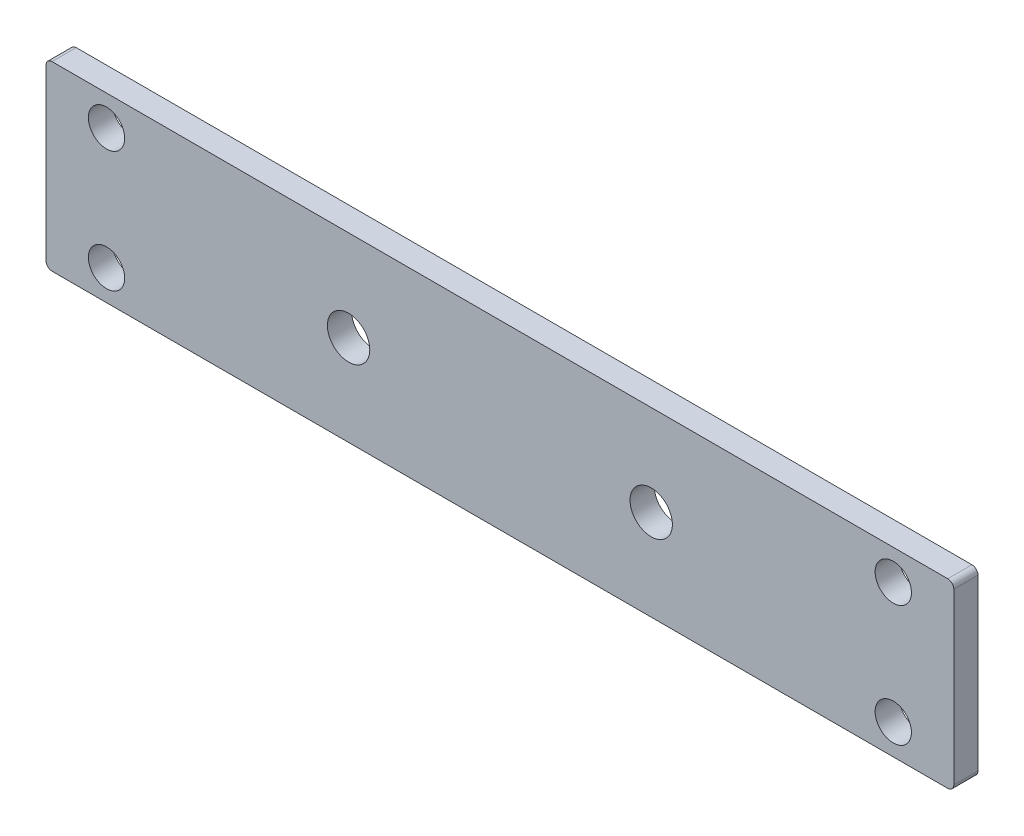
ISO-10303-21;
HEADER;
FILE_DESCRIPTION(('STEP AP214'),'2;1');
FILE_NAME('part.step','',(''),(''),'','','');
FILE_SCHEMA(('AUTOMOTIVE_DESIGN { 1 0 10303 214 1 1 1 1 }'));
ENDSEC;
DATA;
#1=APPLICATION_CONTEXT('core data for automotive mechanical design processes');
#2=APPLICATION_PROTOCOL_DEFINITION('international standard','automotive_design',2000,#1);
#3=PRODUCT_CONTEXT('',#1,'mechanical');
#4=PRODUCT('Part','Part','',(#3));
#5=PRODUCT_RELATED_PRODUCT_CATEGORY('part','',(#4));
#6=PRODUCT_DEFINITION_FORMATION('','',#4);
#7=PRODUCT_DEFINITION_CONTEXT('part definition',#1,'design');
#8=PRODUCT_DEFINITION('design','',#6,#7);
#9=PRODUCT_DEFINITION_SHAPE('','',#8);
#10=(LENGTH_UNIT() NAMED_UNIT(*) SI_UNIT(.MILLI.,.METRE.));
#11=(NAMED_UNIT(*) PLANE_ANGLE_UNIT() SI_UNIT($,.RADIAN.));
#12=(NAMED_UNIT(*) SI_UNIT($,.STERADIAN.) SOLID_ANGLE_UNIT());
#13=UNCERTAINTY_MEASURE_WITH_UNIT(LENGTH_MEASURE(1.E-05),#10,'distance_accuracy_value','');
#14=(GEOMETRIC_REPRESENTATION_CONTEXT(3) GLOBAL_UNCERTAINTY_ASSIGNED_CONTEXT((#13)) GLOBAL_UNIT_ASSIGNED_CONTEXT((#10,
#11,#12)) REPRESENTATION_CONTEXT('',''));
#15=CARTESIAN_POINT('',(0.,0.,0.));
#16=DIRECTION('',(0.,0.,1.));
#17=DIRECTION('',(1.,0.,0.));
#18=AXIS2_PLACEMENT_3D('',#15,#16,#17);
#19=CARTESIAN_POINT('',(-75.,-15.,-4.));
#20=DIRECTION('',(-1.,0.,0.));
#21=DIRECTION('',(0.,0.,1.));
#22=AXIS2_PLACEMENT_3D('',#19,#20,#21);
#23=PLANE('',#22);
#24=DIRECTION('',(0.,-1.,0.));
#25=VECTOR('',#24,1.);
#26=CARTESIAN_POINT('',(-75.,-15.,-4.));
#27=LINE('',#26,#25);
#28=CARTESIAN_POINT('',(-75.,14.,-4.));
#29=VERTEX_POINT('',#28);
#30=CARTESIAN_POINT('',(-75.,-14.,-4.));
#31=VERTEX_POINT('',#30);
#32=EDGE_CURVE('E168',#29,#31,#27,.T.);
#33=ORIENTED_EDGE('',*,*,#32,.T.);
#34=DIRECTION('',(0.,0.,1.));
#35=VECTOR('',#34,1.);
#36=CARTESIAN_POINT('',(-75.,-14.,-4.));
#37=LINE('',#36,#35);
#38=CARTESIAN_POINT('',(-75.,-14.,0.));
#39=VERTEX_POINT('',#38);
#40=EDGE_CURVE('E123',#31,#39,#37,.T.);
#41=ORIENTED_EDGE('',*,*,#40,.T.);
#42=DIRECTION('',(0.,-1.,0.));
#43=VECTOR('',#42,1.);
#44=CARTESIAN_POINT('',(-75.,-15.,0.));
#45=LINE('',#44,#43);
#46=CARTESIAN_POINT('',(-75.,14.,0.));
#47=VERTEX_POINT('',#46);
#48=EDGE_CURVE('E108',#47,#39,#45,.T.);
#49=ORIENTED_EDGE('',*,*,#48,.F.);
#50=DIRECTION('',(0.,0.,1.));
#51=VECTOR('',#50,1.);
#52=CARTESIAN_POINT('',(-75.,14.,-4.));
#53=LINE('',#52,#51);
#54=EDGE_CURVE('E120',#47,#29,#53,.F.);
#55=ORIENTED_EDGE('',*,*,#54,.T.);
#56=EDGE_LOOP('',(#33,#41,#49,#55));
#57=FACE_BOUND('',#56,.T.);
#58=ADVANCED_FACE('F38',(#57),#23,.T.);
#59=CARTESIAN_POINT('',(-75.,15.,-4.));
#60=DIRECTION('',(0.,1.,0.));
#61=DIRECTION('',(0.,0.,1.));
#62=AXIS2_PLACEMENT_3D('',#59,#60,#61);
#63=PLANE('',#62);
#64=DIRECTION('',(-1.,0.,0.));
#65=VECTOR('',#64,1.);
#66=CARTESIAN_POINT('',(-75.,15.,-4.));
#67=LINE('',#66,#65);
#68=CARTESIAN_POINT('',(74.,15.,-4.));
#69=VERTEX_POINT('',#68);
#70=CARTESIAN_POINT('',(-74.,15.,-4.));
#71=VERTEX_POINT('',#70);
#72=EDGE_CURVE('E130',#69,#71,#67,.T.);
#73=ORIENTED_EDGE('',*,*,#72,.T.);
#74=DIRECTION('',(0.,0.,1.));
#75=VECTOR('',#74,1.);
#76=CARTESIAN_POINT('',(-74.,15.,-4.));
#77=LINE('',#76,#75);
#78=CARTESIAN_POINT('',(-74.,15.,0.));
#79=VERTEX_POINT('',#78);
#80=EDGE_CURVE('E11',#71,#79,#77,.T.);
#81=ORIENTED_EDGE('',*,*,#80,.T.);
#82=DIRECTION('',(-1.,0.,0.));
#83=VECTOR('',#82,1.);
#84=CARTESIAN_POINT('',(-75.,15.,0.));
#85=LINE('',#84,#83);
#86=CARTESIAN_POINT('',(74.,15.,0.));
#87=VERTEX_POINT('',#86);
#88=EDGE_CURVE('E110',#87,#79,#85,.T.);
#89=ORIENTED_EDGE('',*,*,#88,.F.);
#90=DIRECTION('',(0.,0.,1.));
#91=VECTOR('',#90,1.);
#92=CARTESIAN_POINT('',(74.,15.,-4.));
#93=LINE('',#92,#91);
#94=EDGE_CURVE('E46',#87,#69,#93,.F.);
#95=ORIENTED_EDGE('',*,*,#94,.T.);
#96=EDGE_LOOP('',(#73,#81,#89,#95));
#97=FACE_BOUND('',#96,.T.);
#98=ADVANCED_FACE('F159',(#97),#63,.T.);
#99=CARTESIAN_POINT('',(75.,-15.,-4.));
#100=DIRECTION('',(1.,0.,0.));
#101=DIRECTION('',(0.,0.,-1.));
#102=AXIS2_PLACEMENT_3D('',#99,#100,#101);
#103=PLANE('',#102);
#104=DIRECTION('',(0.,1.,0.));
#105=VECTOR('',#104,1.);
#106=CARTESIAN_POINT('',(75.,-15.,0.));
#107=LINE('',#106,#105);
#108=CARTESIAN_POINT('',(75.,-14.,0.));
#109=VERTEX_POINT('',#108);
#110=CARTESIAN_POINT('',(75.,14.,0.));
#111=VERTEX_POINT('',#110);
#112=EDGE_CURVE('E166',#109,#111,#107,.T.);
#113=ORIENTED_EDGE('',*,*,#112,.F.);
#114=DIRECTION('',(0.,0.,1.));
#115=VECTOR('',#114,1.);
#116=CARTESIAN_POINT('',(75.,-14.,-4.));
#117=LINE('',#116,#115);
#118=CARTESIAN_POINT('',(75.,-14.,-4.));
#119=VERTEX_POINT('',#118);
#120=EDGE_CURVE('E60',#109,#119,#117,.F.);
#121=ORIENTED_EDGE('',*,*,#120,.T.);
#122=DIRECTION('',(0.,1.,0.));
#123=VECTOR('',#122,1.);
#124=CARTESIAN_POINT('',(75.,-15.,-4.));
#125=LINE('',#124,#123);
#126=CARTESIAN_POINT('',(75.,14.,-4.));
#127=VERTEX_POINT('',#126);
#128=EDGE_CURVE('E134',#119,#127,#125,.T.);
#129=ORIENTED_EDGE('',*,*,#128,.T.);
#130=DIRECTION('',(0.,0.,1.));
#131=VECTOR('',#130,1.);
#132=CARTESIAN_POINT('',(75.,14.,-4.));
#133=LINE('',#132,#131);
#134=EDGE_CURVE('E154',#127,#111,#133,.T.);
#135=ORIENTED_EDGE('',*,*,#134,.T.);
#136=EDGE_LOOP('',(#113,#121,#129,#135));
#137=FACE_BOUND('',#136,.T.);
#138=ADVANCED_FACE('F165',(#137),#103,.T.);
#139=CARTESIAN_POINT('',(-75.,-15.,-4.));
#140=DIRECTION('',(0.,-1.,0.));
#141=DIRECTION('',(0.,0.,-1.));
#142=AXIS2_PLACEMENT_3D('',#139,#140,#141);
#143=PLANE('',#142);
#144=DIRECTION('',(1.,0.,0.));
#145=VECTOR('',#144,1.);
#146=CARTESIAN_POINT('',(-75.,-15.,0.));
#147=LINE('',#146,#145);
#148=CARTESIAN_POINT('',(-74.,-15.,0.));
#149=VERTEX_POINT('',#148);
#150=CARTESIAN_POINT('',(74.,-15.,0.));
#151=VERTEX_POINT('',#150);
#152=EDGE_CURVE('E124',#149,#151,#147,.T.);
#153=ORIENTED_EDGE('',*,*,#152,.F.);
#154=DIRECTION('',(0.,0.,1.));
#155=VECTOR('',#154,1.);
#156=CARTESIAN_POINT('',(-74.,-15.,-4.));
#157=LINE('',#156,#155);
#158=CARTESIAN_POINT('',(-74.,-15.,-4.));
#159=VERTEX_POINT('',#158);
#160=EDGE_CURVE('E146',#149,#159,#157,.F.);
#161=ORIENTED_EDGE('',*,*,#160,.T.);
#162=DIRECTION('',(1.,0.,0.));
#163=VECTOR('',#162,1.);
#164=CARTESIAN_POINT('',(-75.,-15.,-4.));
#165=LINE('',#164,#163);
#166=CARTESIAN_POINT('',(74.,-15.,-4.));
#167=VERTEX_POINT('',#166);
#168=EDGE_CURVE('E172',#159,#167,#165,.T.);
#169=ORIENTED_EDGE('',*,*,#168,.T.);
#170=DIRECTION('',(0.,0.,1.));
#171=VECTOR('',#170,1.);
#172=CARTESIAN_POINT('',(74.,-15.,-4.));
#173=LINE('',#172,#171);
#174=EDGE_CURVE('E143',#167,#151,#173,.T.);
#175=ORIENTED_EDGE('',*,*,#174,.T.);
#176=EDGE_LOOP('',(#153,#161,#169,#175));
#177=FACE_BOUND('',#176,.T.);
#178=ADVANCED_FACE('F256',(#177),#143,.T.);
#179=CARTESIAN_POINT('',(0.,0.,-4.));
#180=DIRECTION('',(0.,0.,-1.));
#181=DIRECTION('',(-1.,0.,0.));
#182=AXIS2_PLACEMENT_3D('',#179,#180,#181);
#183=PLANE('',#182);
#184=CARTESIAN_POINT('',(-64.9999999999999,10.,-4.));
#185=DIRECTION('',(0.,0.,1.));
#186=DIRECTION('',(1.,0.,0.));
#187=AXIS2_PLACEMENT_3D('',#184,#185,#186);
#188=CIRCLE('',#187,3.);
#189=CARTESIAN_POINT('',(-61.9999999999999,10.,-4.));
#190=VERTEX_POINT('',#189);
#191=EDGE_CURVE('E203',#190,#190,#188,.T.);
#192=ORIENTED_EDGE('',*,*,#191,.T.);
#193=EDGE_LOOP('',(#192));
#194=FACE_BOUND('',#193,.T.);
#195=CARTESIAN_POINT('',(-64.9999999999999,-9.99999999999999,-4.));
#196=DIRECTION('',(0.,0.,1.));
#197=DIRECTION('',(1.,0.,0.));
#198=AXIS2_PLACEMENT_3D('',#195,#196,#197);
#199=CIRCLE('',#198,3.);
#200=CARTESIAN_POINT('',(-61.9999999999999,-9.99999999999999,-4.));
#201=VERTEX_POINT('',#200);
#202=EDGE_CURVE('E197',#201,#201,#199,.T.);
#203=ORIENTED_EDGE('',*,*,#202,.T.);
#204=EDGE_LOOP('',(#203));
#205=FACE_BOUND('',#204,.T.);
#206=CARTESIAN_POINT('',(65.0000000000001,10.,-4.));
#207=DIRECTION('',(0.,0.,1.));
#208=DIRECTION('',(1.,0.,0.));
#209=AXIS2_PLACEMENT_3D('',#206,#207,#208);
#210=CIRCLE('',#209,2.99999999999999);
#211=CARTESIAN_POINT('',(68.0000000000001,10.,-4.));
#212=VERTEX_POINT('',#211);
#213=EDGE_CURVE('E191',#212,#212,#210,.T.);
#214=ORIENTED_EDGE('',*,*,#213,.T.);
#215=EDGE_LOOP('',(#214));
#216=FACE_BOUND('',#215,.T.);
#217=CARTESIAN_POINT('',(65.0000000000001,-9.99999999999999,-4.));
#218=DIRECTION('',(0.,0.,1.));
#219=DIRECTION('',(1.,0.,0.));
#220=AXIS2_PLACEMENT_3D('',#217,#218,#219);
#221=CIRCLE('',#220,3.00000000000001);
#222=CARTESIAN_POINT('',(68.0000000000001,-9.99999999999999,-4.));
#223=VERTEX_POINT('',#222);
#224=EDGE_CURVE('E185',#223,#223,#221,.T.);
#225=ORIENTED_EDGE('',*,*,#224,.T.);
#226=EDGE_LOOP('',(#225));
#227=FACE_BOUND('',#226,.T.);
#228=CARTESIAN_POINT('',(-25.,-1.73472347597681E-13,-4.));
#229=DIRECTION('',(0.,0.,1.));
#230=DIRECTION('',(1.,0.,0.));
#231=AXIS2_PLACEMENT_3D('',#228,#229,#230);
#232=CIRCLE('',#231,3.5);
#233=CARTESIAN_POINT('',(-21.5,-1.73472347597681E-13,-4.));
#234=VERTEX_POINT('',#233);
#235=EDGE_CURVE('E179',#234,#234,#232,.T.);
#236=ORIENTED_EDGE('',*,*,#235,.T.);
#237=EDGE_LOOP('',(#236));
#238=FACE_BOUND('',#237,.T.);
#239=CARTESIAN_POINT('',(25.,0.,-4.));
#240=DIRECTION('',(0.,0.,1.));
#241=DIRECTION('',(1.,0.,0.));
#242=AXIS2_PLACEMENT_3D('',#239,#240,#241);
#243=CIRCLE('',#242,3.5);
#244=CARTESIAN_POINT('',(28.5,0.,-4.));
#245=VERTEX_POINT('',#244);
#246=EDGE_CURVE('E125',#245,#245,#243,.T.);
#247=ORIENTED_EDGE('',*,*,#246,.T.);
#248=EDGE_LOOP('',(#247));
#249=FACE_BOUND('',#248,.T.);
#250=ORIENTED_EDGE('',*,*,#168,.F.);
#251=CARTESIAN_POINT('',(-74.,-14.,-4.));
#252=DIRECTION('',(0.,0.,-1.));
#253=DIRECTION('',(-1.,0.,0.));
#254=AXIS2_PLACEMENT_3D('',#251,#252,#253);
#255=CIRCLE('',#254,1.);
#256=EDGE_CURVE('E152',#159,#31,#255,.T.);
#257=ORIENTED_EDGE('',*,*,#256,.T.);
#258=ORIENTED_EDGE('',*,*,#32,.F.);
#259=CARTESIAN_POINT('',(-74.,14.,-4.));
#260=DIRECTION('',(0.,0.,-1.));
#261=DIRECTION('',(-1.,0.,0.));
#262=AXIS2_PLACEMENT_3D('',#259,#260,#261);
#263=CIRCLE('',#262,1.);
#264=EDGE_CURVE('E129',#29,#71,#263,.T.);
#265=ORIENTED_EDGE('',*,*,#264,.T.);
#266=ORIENTED_EDGE('',*,*,#72,.F.);
#267=CARTESIAN_POINT('',(74.,14.,-4.));
#268=DIRECTION('',(0.,0.,-1.));
#269=DIRECTION('',(-1.,0.,0.));
#270=AXIS2_PLACEMENT_3D('',#267,#268,#269);
#271=CIRCLE('',#270,1.);
#272=EDGE_CURVE('E53',#69,#127,#271,.T.);
#273=ORIENTED_EDGE('',*,*,#272,.T.);
#274=ORIENTED_EDGE('',*,*,#128,.F.);
#275=CARTESIAN_POINT('',(74.,-14.,-4.));
#276=DIRECTION('',(0.,0.,-1.));
#277=DIRECTION('',(-1.,0.,0.));
#278=AXIS2_PLACEMENT_3D('',#275,#276,#277);
#279=CIRCLE('',#278,1.);
#280=EDGE_CURVE('E150',#119,#167,#279,.T.);
#281=ORIENTED_EDGE('',*,*,#280,.T.);
#282=EDGE_LOOP('',(#250,#257,#258,#265,#266,#273,#274,#281));
#283=FACE_BOUND('',#282,.T.);
#284=ADVANCED_FACE('F162',(#194,#205,#216,#227,#238,#249,#283),#183,.T.);
#285=CARTESIAN_POINT('',(0.,0.,0.));
#286=DIRECTION('',(0.,0.,-1.));
#287=DIRECTION('',(-1.,0.,0.));
#288=AXIS2_PLACEMENT_3D('',#285,#286,#287);
#289=PLANE('',#288);
#290=CARTESIAN_POINT('',(-64.9999999999999,10.,0.));
#291=DIRECTION('',(0.,0.,1.));
#292=DIRECTION('',(1.,0.,0.));
#293=AXIS2_PLACEMENT_3D('',#290,#291,#292);
#294=CIRCLE('',#293,3.);
#295=CARTESIAN_POINT('',(-61.9999999999999,10.,0.));
#296=VERTEX_POINT('',#295);
#297=EDGE_CURVE('E206',#296,#296,#294,.T.);
#298=ORIENTED_EDGE('',*,*,#297,.F.);
#299=EDGE_LOOP('',(#298));
#300=FACE_BOUND('',#299,.T.);
#301=CARTESIAN_POINT('',(-64.9999999999999,-9.99999999999999,0.));
#302=DIRECTION('',(0.,0.,1.));
#303=DIRECTION('',(1.,0.,0.));
#304=AXIS2_PLACEMENT_3D('',#301,#302,#303);
#305=CIRCLE('',#304,3.);
#306=CARTESIAN_POINT('',(-61.9999999999999,-9.99999999999999,0.));
#307=VERTEX_POINT('',#306);
#308=EDGE_CURVE('E200',#307,#307,#305,.T.);
#309=ORIENTED_EDGE('',*,*,#308,.F.);
#310=EDGE_LOOP('',(#309));
#311=FACE_BOUND('',#310,.T.);
#312=CARTESIAN_POINT('',(65.0000000000001,10.,0.));
#313=DIRECTION('',(0.,0.,1.));
#314=DIRECTION('',(1.,0.,0.));
#315=AXIS2_PLACEMENT_3D('',#312,#313,#314);
#316=CIRCLE('',#315,2.99999999999999);
#317=CARTESIAN_POINT('',(68.0000000000001,10.,0.));
#318=VERTEX_POINT('',#317);
#319=EDGE_CURVE('E194',#318,#318,#316,.T.);
#320=ORIENTED_EDGE('',*,*,#319,.F.);
#321=EDGE_LOOP('',(#320));
#322=FACE_BOUND('',#321,.T.);
#323=CARTESIAN_POINT('',(65.0000000000001,-9.99999999999999,0.));
#324=DIRECTION('',(0.,0.,1.));
#325=DIRECTION('',(1.,0.,0.));
#326=AXIS2_PLACEMENT_3D('',#323,#324,#325);
#327=CIRCLE('',#326,3.00000000000001);
#328=CARTESIAN_POINT('',(68.0000000000001,-9.99999999999999,0.));
#329=VERTEX_POINT('',#328);
#330=EDGE_CURVE('E188',#329,#329,#327,.T.);
#331=ORIENTED_EDGE('',*,*,#330,.F.);
#332=EDGE_LOOP('',(#331));
#333=FACE_BOUND('',#332,.T.);
#334=CARTESIAN_POINT('',(-25.,-1.73472347597681E-13,0.));
#335=DIRECTION('',(0.,0.,1.));
#336=DIRECTION('',(1.,0.,0.));
#337=AXIS2_PLACEMENT_3D('',#334,#335,#336);
#338=CIRCLE('',#337,3.5);
#339=CARTESIAN_POINT('',(-21.5,-1.73472347597681E-13,0.));
#340=VERTEX_POINT('',#339);
#341=EDGE_CURVE('E182',#340,#340,#338,.T.);
#342=ORIENTED_EDGE('',*,*,#341,.F.);
#343=EDGE_LOOP('',(#342));
#344=FACE_BOUND('',#343,.T.);
#345=CARTESIAN_POINT('',(25.,0.,0.));
#346=DIRECTION('',(0.,0.,1.));
#347=DIRECTION('',(1.,0.,0.));
#348=AXIS2_PLACEMENT_3D('',#345,#346,#347);
#349=CIRCLE('',#348,3.5);
#350=CARTESIAN_POINT('',(28.5,0.,0.));
#351=VERTEX_POINT('',#350);
#352=EDGE_CURVE('E176',#351,#351,#349,.T.);
#353=ORIENTED_EDGE('',*,*,#352,.F.);
#354=EDGE_LOOP('',(#353));
#355=FACE_BOUND('',#354,.T.);
#356=ORIENTED_EDGE('',*,*,#48,.T.);
#357=CARTESIAN_POINT('',(-74.,-14.,0.));
#358=DIRECTION('',(0.,0.,-1.));
#359=DIRECTION('',(-1.,0.,0.));
#360=AXIS2_PLACEMENT_3D('',#357,#358,#359);
#361=CIRCLE('',#360,1.);
#362=EDGE_CURVE('E141',#39,#149,#361,.F.);
#363=ORIENTED_EDGE('',*,*,#362,.T.);
#364=ORIENTED_EDGE('',*,*,#152,.T.);
#365=CARTESIAN_POINT('',(74.,-14.,0.));
#366=DIRECTION('',(0.,0.,-1.));
#367=DIRECTION('',(-1.,0.,0.));
#368=AXIS2_PLACEMENT_3D('',#365,#366,#367);
#369=CIRCLE('',#368,1.);
#370=EDGE_CURVE('E114',#151,#109,#369,.F.);
#371=ORIENTED_EDGE('',*,*,#370,.T.);
#372=ORIENTED_EDGE('',*,*,#112,.T.);
#373=CARTESIAN_POINT('',(74.,14.,0.));
#374=DIRECTION('',(0.,0.,-1.));
#375=DIRECTION('',(-1.,0.,0.));
#376=AXIS2_PLACEMENT_3D('',#373,#374,#375);
#377=CIRCLE('',#376,1.);
#378=EDGE_CURVE('E115',#111,#87,#377,.F.);
#379=ORIENTED_EDGE('',*,*,#378,.T.);
#380=ORIENTED_EDGE('',*,*,#88,.T.);
#381=CARTESIAN_POINT('',(-74.,14.,0.));
#382=DIRECTION('',(0.,0.,-1.));
#383=DIRECTION('',(-1.,0.,0.));
#384=AXIS2_PLACEMENT_3D('',#381,#382,#383);
#385=CIRCLE('',#384,1.);
#386=EDGE_CURVE('E105',#79,#47,#385,.F.);
#387=ORIENTED_EDGE('',*,*,#386,.T.);
#388=EDGE_LOOP('',(#356,#363,#364,#371,#372,#379,#380,#387));
#389=FACE_BOUND('',#388,.T.);
#390=ADVANCED_FACE('F107',(#300,#311,#322,#333,#344,#355,#389),#289,.F.);
#391=CARTESIAN_POINT('',(25.,0.,-4.));
#392=DIRECTION('',(0.,0.,1.));
#393=DIRECTION('',(1.,0.,0.));
#394=AXIS2_PLACEMENT_3D('',#391,#392,#393);
#395=CYLINDRICAL_SURFACE('',#394,3.5);
#396=ORIENTED_EDGE('',*,*,#246,.F.);
#397=EDGE_LOOP('',(#396));
#398=FACE_BOUND('',#397,.T.);
#399=ORIENTED_EDGE('',*,*,#352,.T.);
#400=EDGE_LOOP('',(#399));
#401=FACE_BOUND('',#400,.T.);
#402=ADVANCED_FACE('F224',(#398,#401),#395,.F.);
#403=CARTESIAN_POINT('',(-25.,-1.73472347597681E-13,-4.));
#404=DIRECTION('',(0.,0.,1.));
#405=DIRECTION('',(1.,0.,0.));
#406=AXIS2_PLACEMENT_3D('',#403,#404,#405);
#407=CYLINDRICAL_SURFACE('',#406,3.5);
#408=ORIENTED_EDGE('',*,*,#235,.F.);
#409=EDGE_LOOP('',(#408));
#410=FACE_BOUND('',#409,.T.);
#411=ORIENTED_EDGE('',*,*,#341,.T.);
#412=EDGE_LOOP('',(#411));
#413=FACE_BOUND('',#412,.T.);
#414=ADVANCED_FACE('F237',(#410,#413),#407,.F.);
#415=CARTESIAN_POINT('',(65.0000000000001,-9.99999999999999,-4.));
#416=DIRECTION('',(0.,0.,1.));
#417=DIRECTION('',(1.,0.,0.));
#418=AXIS2_PLACEMENT_3D('',#415,#416,#417);
#419=CYLINDRICAL_SURFACE('',#418,3.00000000000001);
#420=ORIENTED_EDGE('',*,*,#224,.F.);
#421=EDGE_LOOP('',(#420));
#422=FACE_BOUND('',#421,.T.);
#423=ORIENTED_EDGE('',*,*,#330,.T.);
#424=EDGE_LOOP('',(#423));
#425=FACE_BOUND('',#424,.T.);
#426=ADVANCED_FACE('F243',(#422,#425),#419,.F.);
#427=CARTESIAN_POINT('',(65.0000000000001,10.,-4.));
#428=DIRECTION('',(0.,0.,1.));
#429=DIRECTION('',(1.,0.,0.));
#430=AXIS2_PLACEMENT_3D('',#427,#428,#429);
#431=CYLINDRICAL_SURFACE('',#430,2.99999999999999);
#432=ORIENTED_EDGE('',*,*,#213,.F.);
#433=EDGE_LOOP('',(#432));
#434=FACE_BOUND('',#433,.T.);
#435=ORIENTED_EDGE('',*,*,#319,.T.);
#436=EDGE_LOOP('',(#435));
#437=FACE_BOUND('',#436,.T.);
#438=ADVANCED_FACE('F347',(#434,#437),#431,.F.);
#439=CARTESIAN_POINT('',(-64.9999999999999,-9.99999999999999,-4.));
#440=DIRECTION('',(0.,0.,1.));
#441=DIRECTION('',(1.,0.,0.));
#442=AXIS2_PLACEMENT_3D('',#439,#440,#441);
#443=CYLINDRICAL_SURFACE('',#442,3.);
#444=ORIENTED_EDGE('',*,*,#202,.F.);
#445=EDGE_LOOP('',(#444));
#446=FACE_BOUND('',#445,.T.);
#447=ORIENTED_EDGE('',*,*,#308,.T.);
#448=EDGE_LOOP('',(#447));
#449=FACE_BOUND('',#448,.T.);
#450=ADVANCED_FACE('F218',(#446,#449),#443,.F.);
#451=CARTESIAN_POINT('',(-64.9999999999999,10.,-4.));
#452=DIRECTION('',(0.,0.,1.));
#453=DIRECTION('',(1.,0.,0.));
#454=AXIS2_PLACEMENT_3D('',#451,#452,#453);
#455=CYLINDRICAL_SURFACE('',#454,3.);
#456=ORIENTED_EDGE('',*,*,#191,.F.);
#457=EDGE_LOOP('',(#456));
#458=FACE_BOUND('',#457,.T.);
#459=ORIENTED_EDGE('',*,*,#297,.T.);
#460=EDGE_LOOP('',(#459));
#461=FACE_BOUND('',#460,.T.);
#462=ADVANCED_FACE('F214',(#458,#461),#455,.F.);
#463=CARTESIAN_POINT('',(-74.,-14.,-4.));
#464=DIRECTION('',(0.,0.,1.));
#465=DIRECTION('',(1.,0.,0.));
#466=AXIS2_PLACEMENT_3D('',#463,#464,#465);
#467=CYLINDRICAL_SURFACE('',#466,1.);
#468=ORIENTED_EDGE('',*,*,#256,.F.);
#469=ORIENTED_EDGE('',*,*,#160,.F.);
#470=ORIENTED_EDGE('',*,*,#362,.F.);
#471=ORIENTED_EDGE('',*,*,#40,.F.);
#472=EDGE_LOOP('',(#468,#469,#470,#471));
#473=FACE_BOUND('',#472,.T.);
#474=ADVANCED_FACE('F217',(#473),#467,.T.);
#475=CARTESIAN_POINT('',(74.,-14.,-4.));
#476=DIRECTION('',(0.,0.,1.));
#477=DIRECTION('',(1.,0.,0.));
#478=AXIS2_PLACEMENT_3D('',#475,#476,#477);
#479=CYLINDRICAL_SURFACE('',#478,1.);
#480=ORIENTED_EDGE('',*,*,#280,.F.);
#481=ORIENTED_EDGE('',*,*,#120,.F.);
#482=ORIENTED_EDGE('',*,*,#370,.F.);
#483=ORIENTED_EDGE('',*,*,#174,.F.);
#484=EDGE_LOOP('',(#480,#481,#482,#483));
#485=FACE_BOUND('',#484,.T.);
#486=ADVANCED_FACE('F260',(#485),#479,.T.);
#487=CARTESIAN_POINT('',(-74.,14.,-4.));
#488=DIRECTION('',(0.,0.,1.));
#489=DIRECTION('',(1.,0.,0.));
#490=AXIS2_PLACEMENT_3D('',#487,#488,#489);
#491=CYLINDRICAL_SURFACE('',#490,1.);
#492=ORIENTED_EDGE('',*,*,#264,.F.);
#493=ORIENTED_EDGE('',*,*,#54,.F.);
#494=ORIENTED_EDGE('',*,*,#386,.F.);
#495=ORIENTED_EDGE('',*,*,#80,.F.);
#496=EDGE_LOOP('',(#492,#493,#494,#495));
#497=FACE_BOUND('',#496,.T.);
#498=ADVANCED_FACE('F128',(#497),#491,.T.);
#499=CARTESIAN_POINT('',(74.,14.,-4.));
#500=DIRECTION('',(0.,0.,1.));
#501=DIRECTION('',(1.,0.,0.));
#502=AXIS2_PLACEMENT_3D('',#499,#500,#501);
#503=CYLINDRICAL_SURFACE('',#502,1.);
#504=ORIENTED_EDGE('',*,*,#272,.F.);
#505=ORIENTED_EDGE('',*,*,#94,.F.);
#506=ORIENTED_EDGE('',*,*,#378,.F.);
#507=ORIENTED_EDGE('',*,*,#134,.F.);
#508=EDGE_LOOP('',(#504,#505,#506,#507));
#509=FACE_BOUND('',#508,.T.);
#510=ADVANCED_FACE('F40',(#509),#503,.T.);
#511=CLOSED_SHELL('',(#58,#98,#138,#178,#284,#390,#402,#414,#426,#438,#450,#462,#474,#486,#498,#510));
#512=MANIFOLD_SOLID_BREP('B2',#511);
#513=ADVANCED_BREP_SHAPE_REPRESENTATION('',(#18,#512),#14);
#514=SHAPE_DEFINITION_REPRESENTATION(#9,#513);
ENDSEC;
END-ISO-10303-21;
